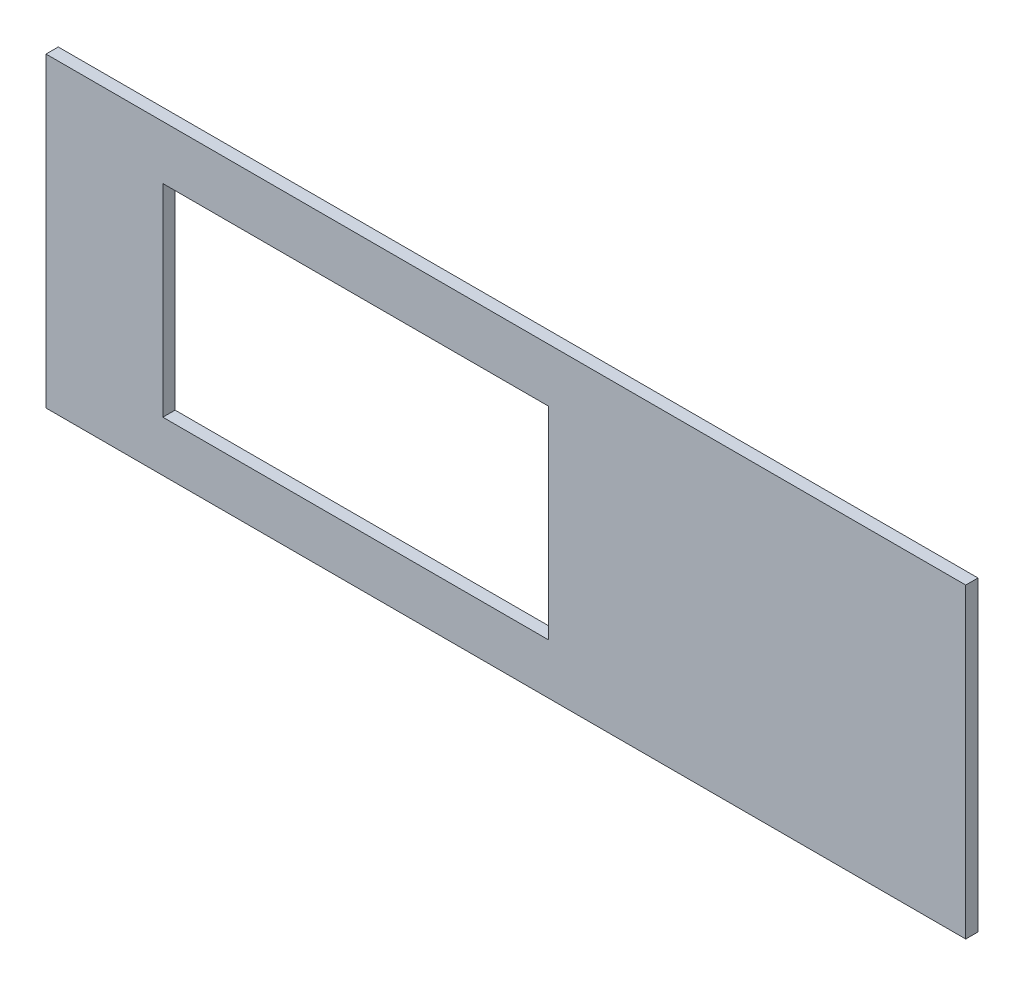
ISO-10303-21;
HEADER;
FILE_DESCRIPTION(('STEP AP214'),'2;1');
FILE_NAME('part.step','',(''),(''),'','','');
FILE_SCHEMA(('AUTOMOTIVE_DESIGN { 1 0 10303 214 1 1 1 1 }'));
ENDSEC;
DATA;
#1=APPLICATION_CONTEXT('core data for automotive mechanical design processes');
#2=APPLICATION_PROTOCOL_DEFINITION('international standard','automotive_design',2000,#1);
#3=PRODUCT_CONTEXT('',#1,'mechanical');
#4=PRODUCT('Part','Part','',(#3));
#5=PRODUCT_RELATED_PRODUCT_CATEGORY('part','',(#4));
#6=PRODUCT_DEFINITION_FORMATION('','',#4);
#7=PRODUCT_DEFINITION_CONTEXT('part definition',#1,'design');
#8=PRODUCT_DEFINITION('design','',#6,#7);
#9=PRODUCT_DEFINITION_SHAPE('','',#8);
#10=(LENGTH_UNIT() NAMED_UNIT(*) SI_UNIT(.MILLI.,.METRE.));
#11=(NAMED_UNIT(*) PLANE_ANGLE_UNIT() SI_UNIT($,.RADIAN.));
#12=(NAMED_UNIT(*) SI_UNIT($,.STERADIAN.) SOLID_ANGLE_UNIT());
#13=UNCERTAINTY_MEASURE_WITH_UNIT(LENGTH_MEASURE(1.E-05),#10,'distance_accuracy_value','');
#14=(GEOMETRIC_REPRESENTATION_CONTEXT(3) GLOBAL_UNCERTAINTY_ASSIGNED_CONTEXT((#13)) GLOBAL_UNIT_ASSIGNED_CONTEXT((#10,
#11,#12)) REPRESENTATION_CONTEXT('',''));
#15=CARTESIAN_POINT('',(0.,0.,0.));
#16=DIRECTION('',(0.,0.,1.));
#17=DIRECTION('',(1.,0.,0.));
#18=AXIS2_PLACEMENT_3D('',#15,#16,#17);
#19=CARTESIAN_POINT('',(-352.653061224484,0.,-12.));
#20=DIRECTION('',(-1.,0.,0.));
#21=DIRECTION('',(0.,-1.,0.));
#22=AXIS2_PLACEMENT_3D('',#19,#20,#21);
#23=PLANE('',#22);
#24=DIRECTION('',(0.,-1.,0.));
#25=VECTOR('',#24,1.);
#26=CARTESIAN_POINT('',(-352.653061224484,0.,0.));
#27=LINE('',#26,#25);
#28=CARTESIAN_POINT('',(-352.653061224483,300.,0.));
#29=VERTEX_POINT('',#28);
#30=CARTESIAN_POINT('',(-352.653061224484,0.,0.));
#31=VERTEX_POINT('',#30);
#32=EDGE_CURVE('E131',#29,#31,#27,.T.);
#33=ORIENTED_EDGE('',*,*,#32,.F.);
#34=DIRECTION('',(0.,0.,1.));
#35=VECTOR('',#34,1.);
#36=CARTESIAN_POINT('',(-352.653061224483,300.,-12.));
#37=LINE('',#36,#35);
#38=CARTESIAN_POINT('',(-352.653061224483,300.,-12.));
#39=VERTEX_POINT('',#38);
#40=EDGE_CURVE('E11',#39,#29,#37,.T.);
#41=ORIENTED_EDGE('',*,*,#40,.F.);
#42=DIRECTION('',(0.,-1.,0.));
#43=VECTOR('',#42,1.);
#44=CARTESIAN_POINT('',(-352.653061224484,0.,-12.));
#45=LINE('',#44,#43);
#46=CARTESIAN_POINT('',(-352.653061224484,0.,-12.));
#47=VERTEX_POINT('',#46);
#48=EDGE_CURVE('E135',#39,#47,#45,.T.);
#49=ORIENTED_EDGE('',*,*,#48,.T.);
#50=DIRECTION('',(0.,0.,1.));
#51=VECTOR('',#50,1.);
#52=CARTESIAN_POINT('',(-352.653061224484,0.,-12.));
#53=LINE('',#52,#51);
#54=EDGE_CURVE('E36',#47,#31,#53,.T.);
#55=ORIENTED_EDGE('',*,*,#54,.T.);
#56=EDGE_LOOP('',(#33,#41,#49,#55));
#57=FACE_BOUND('',#56,.T.);
#58=ADVANCED_FACE('F33',(#57),#23,.T.);
#59=CARTESIAN_POINT('',(-352.653061224483,300.,-12.));
#60=DIRECTION('',(0.,1.,0.));
#61=DIRECTION('',(0.,0.,1.));
#62=AXIS2_PLACEMENT_3D('',#59,#60,#61);
#63=PLANE('',#62);
#64=DIRECTION('',(-1.,0.,0.));
#65=VECTOR('',#64,1.);
#66=CARTESIAN_POINT('',(-352.653061224483,300.,0.));
#67=LINE('',#66,#65);
#68=CARTESIAN_POINT('',(547.34693877551,300.,0.));
#69=VERTEX_POINT('',#68);
#70=EDGE_CURVE('E139',#69,#29,#67,.T.);
#71=ORIENTED_EDGE('',*,*,#70,.F.);
#72=DIRECTION('',(0.,0.,1.));
#73=VECTOR('',#72,1.);
#74=CARTESIAN_POINT('',(547.34693877551,300.,-12.));
#75=LINE('',#74,#73);
#76=CARTESIAN_POINT('',(547.34693877551,300.,-12.));
#77=VERTEX_POINT('',#76);
#78=EDGE_CURVE('E41',#77,#69,#75,.T.);
#79=ORIENTED_EDGE('',*,*,#78,.F.);
#80=DIRECTION('',(-1.,0.,0.));
#81=VECTOR('',#80,1.);
#82=CARTESIAN_POINT('',(-352.653061224483,300.,-12.));
#83=LINE('',#82,#81);
#84=EDGE_CURVE('E145',#77,#39,#83,.T.);
#85=ORIENTED_EDGE('',*,*,#84,.T.);
#86=ORIENTED_EDGE('',*,*,#40,.T.);
#87=EDGE_LOOP('',(#71,#79,#85,#86));
#88=FACE_BOUND('',#87,.T.);
#89=ADVANCED_FACE('F171',(#88),#63,.T.);
#90=CARTESIAN_POINT('',(547.34693877551,0.,-12.));
#91=DIRECTION('',(1.,0.,0.));
#92=DIRECTION('',(0.,0.,-1.));
#93=AXIS2_PLACEMENT_3D('',#90,#91,#92);
#94=PLANE('',#93);
#95=DIRECTION('',(0.,1.,0.));
#96=VECTOR('',#95,1.);
#97=CARTESIAN_POINT('',(547.34693877551,0.,0.));
#98=LINE('',#97,#96);
#99=CARTESIAN_POINT('',(547.34693877551,0.,0.));
#100=VERTEX_POINT('',#99);
#101=EDGE_CURVE('E153',#100,#69,#98,.T.);
#102=ORIENTED_EDGE('',*,*,#101,.F.);
#103=DIRECTION('',(0.,0.,1.));
#104=VECTOR('',#103,1.);
#105=CARTESIAN_POINT('',(547.34693877551,0.,-12.));
#106=LINE('',#105,#104);
#107=CARTESIAN_POINT('',(547.34693877551,0.,-12.));
#108=VERTEX_POINT('',#107);
#109=EDGE_CURVE('E158',#108,#100,#106,.T.);
#110=ORIENTED_EDGE('',*,*,#109,.F.);
#111=DIRECTION('',(0.,1.,0.));
#112=VECTOR('',#111,1.);
#113=CARTESIAN_POINT('',(547.34693877551,0.,-12.));
#114=LINE('',#113,#112);
#115=EDGE_CURVE('E142',#108,#77,#114,.T.);
#116=ORIENTED_EDGE('',*,*,#115,.T.);
#117=ORIENTED_EDGE('',*,*,#78,.T.);
#118=EDGE_LOOP('',(#102,#110,#116,#117));
#119=FACE_BOUND('',#118,.T.);
#120=ADVANCED_FACE('F175',(#119),#94,.T.);
#121=CARTESIAN_POINT('',(-352.653061224484,0.,-12.));
#122=DIRECTION('',(0.,-1.,0.));
#123=DIRECTION('',(0.,0.,-1.));
#124=AXIS2_PLACEMENT_3D('',#121,#122,#123);
#125=PLANE('',#124);
#126=DIRECTION('',(1.,0.,0.));
#127=VECTOR('',#126,1.);
#128=CARTESIAN_POINT('',(-352.653061224484,0.,0.));
#129=LINE('',#128,#127);
#130=EDGE_CURVE('E150',#31,#100,#129,.T.);
#131=ORIENTED_EDGE('',*,*,#130,.F.);
#132=ORIENTED_EDGE('',*,*,#54,.F.);
#133=DIRECTION('',(1.,0.,0.));
#134=VECTOR('',#133,1.);
#135=CARTESIAN_POINT('',(-352.653061224484,0.,-12.));
#136=LINE('',#135,#134);
#137=EDGE_CURVE('E138',#47,#108,#136,.T.);
#138=ORIENTED_EDGE('',*,*,#137,.T.);
#139=ORIENTED_EDGE('',*,*,#109,.T.);
#140=EDGE_LOOP('',(#131,#132,#138,#139));
#141=FACE_BOUND('',#140,.T.);
#142=ADVANCED_FACE('F166',(#141),#125,.T.);
#143=CARTESIAN_POINT('',(0.,0.,-12.));
#144=DIRECTION('',(0.,0.,-1.));
#145=DIRECTION('',(-1.,0.,0.));
#146=AXIS2_PLACEMENT_3D('',#143,#144,#145);
#147=PLANE('',#146);
#148=DIRECTION('',(0.,1.,0.));
#149=VECTOR('',#148,1.);
#150=CARTESIAN_POINT('',(139.150083362304,49.4032246659231,-12.));
#151=LINE('',#150,#149);
#152=CARTESIAN_POINT('',(139.150083362304,49.4032246659231,-12.));
#153=VERTEX_POINT('',#152);
#154=CARTESIAN_POINT('',(139.150083362304,247.444008379091,-12.));
#155=VERTEX_POINT('',#154);
#156=EDGE_CURVE('E100',#153,#155,#151,.T.);
#157=ORIENTED_EDGE('',*,*,#156,.T.);
#158=DIRECTION('',(-1.,0.,0.));
#159=VECTOR('',#158,1.);
#160=CARTESIAN_POINT('',(139.150083362304,247.444008379091,-12.));
#161=LINE('',#160,#159);
#162=CARTESIAN_POINT('',(-238.316927651788,247.444008379091,-12.));
#163=VERTEX_POINT('',#162);
#164=EDGE_CURVE('E109',#155,#163,#161,.T.);
#165=ORIENTED_EDGE('',*,*,#164,.T.);
#166=DIRECTION('',(0.,-1.,0.));
#167=VECTOR('',#166,1.);
#168=CARTESIAN_POINT('',(-238.316927651788,49.4032246659231,-12.));
#169=LINE('',#168,#167);
#170=CARTESIAN_POINT('',(-238.316927651788,49.4032246659231,-12.));
#171=VERTEX_POINT('',#170);
#172=EDGE_CURVE('E49',#163,#171,#169,.T.);
#173=ORIENTED_EDGE('',*,*,#172,.T.);
#174=DIRECTION('',(1.,0.,0.));
#175=VECTOR('',#174,1.);
#176=CARTESIAN_POINT('',(139.150083362304,49.4032246659231,-12.));
#177=LINE('',#176,#175);
#178=EDGE_CURVE('E106',#171,#153,#177,.T.);
#179=ORIENTED_EDGE('',*,*,#178,.T.);
#180=EDGE_LOOP('',(#157,#165,#173,#179));
#181=FACE_BOUND('',#180,.T.);
#182=ORIENTED_EDGE('',*,*,#48,.F.);
#183=ORIENTED_EDGE('',*,*,#84,.F.);
#184=ORIENTED_EDGE('',*,*,#115,.F.);
#185=ORIENTED_EDGE('',*,*,#137,.F.);
#186=EDGE_LOOP('',(#182,#183,#184,#185));
#187=FACE_BOUND('',#186,.T.);
#188=ADVANCED_FACE('F113',(#181,#187),#147,.T.);
#189=CARTESIAN_POINT('',(0.,0.,0.));
#190=DIRECTION('',(0.,0.,-1.));
#191=DIRECTION('',(-1.,0.,0.));
#192=AXIS2_PLACEMENT_3D('',#189,#190,#191);
#193=PLANE('',#192);
#194=DIRECTION('',(-1.,0.,0.));
#195=VECTOR('',#194,1.);
#196=CARTESIAN_POINT('',(139.150083362304,247.444008379091,0.));
#197=LINE('',#196,#195);
#198=CARTESIAN_POINT('',(139.150083362304,247.444008379091,0.));
#199=VERTEX_POINT('',#198);
#200=CARTESIAN_POINT('',(-238.316927651788,247.444008379091,0.));
#201=VERTEX_POINT('',#200);
#202=EDGE_CURVE('E125',#199,#201,#197,.T.);
#203=ORIENTED_EDGE('',*,*,#202,.F.);
#204=DIRECTION('',(0.,1.,0.));
#205=VECTOR('',#204,1.);
#206=CARTESIAN_POINT('',(139.150083362304,49.4032246659231,0.));
#207=LINE('',#206,#205);
#208=CARTESIAN_POINT('',(139.150083362304,49.4032246659231,0.));
#209=VERTEX_POINT('',#208);
#210=EDGE_CURVE('E57',#209,#199,#207,.T.);
#211=ORIENTED_EDGE('',*,*,#210,.F.);
#212=DIRECTION('',(1.,0.,0.));
#213=VECTOR('',#212,1.);
#214=CARTESIAN_POINT('',(139.150083362304,49.4032246659231,0.));
#215=LINE('',#214,#213);
#216=CARTESIAN_POINT('',(-238.316927651788,49.4032246659231,0.));
#217=VERTEX_POINT('',#216);
#218=EDGE_CURVE('E116',#217,#209,#215,.T.);
#219=ORIENTED_EDGE('',*,*,#218,.F.);
#220=DIRECTION('',(0.,-1.,0.));
#221=VECTOR('',#220,1.);
#222=CARTESIAN_POINT('',(-238.316927651788,49.4032246659231,0.));
#223=LINE('',#222,#221);
#224=EDGE_CURVE('E119',#201,#217,#223,.T.);
#225=ORIENTED_EDGE('',*,*,#224,.F.);
#226=EDGE_LOOP('',(#203,#211,#219,#225));
#227=FACE_BOUND('',#226,.T.);
#228=ORIENTED_EDGE('',*,*,#32,.T.);
#229=ORIENTED_EDGE('',*,*,#130,.T.);
#230=ORIENTED_EDGE('',*,*,#101,.T.);
#231=ORIENTED_EDGE('',*,*,#70,.T.);
#232=EDGE_LOOP('',(#228,#229,#230,#231));
#233=FACE_BOUND('',#232,.T.);
#234=ADVANCED_FACE('F168',(#227,#233),#193,.F.);
#235=CARTESIAN_POINT('',(139.150083362304,49.4032246659231,-12.));
#236=DIRECTION('',(1.,0.,0.));
#237=DIRECTION('',(0.,0.,-1.));
#238=AXIS2_PLACEMENT_3D('',#235,#236,#237);
#239=PLANE('',#238);
#240=ORIENTED_EDGE('',*,*,#210,.T.);
#241=DIRECTION('',(0.,0.,1.));
#242=VECTOR('',#241,1.);
#243=CARTESIAN_POINT('',(139.150083362304,247.444008379091,-12.));
#244=LINE('',#243,#242);
#245=EDGE_CURVE('E96',#155,#199,#244,.T.);
#246=ORIENTED_EDGE('',*,*,#245,.F.);
#247=ORIENTED_EDGE('',*,*,#156,.F.);
#248=DIRECTION('',(0.,0.,1.));
#249=VECTOR('',#248,1.);
#250=CARTESIAN_POINT('',(139.150083362304,49.4032246659231,-12.));
#251=LINE('',#250,#249);
#252=EDGE_CURVE('E129',#153,#209,#251,.T.);
#253=ORIENTED_EDGE('',*,*,#252,.T.);
#254=EDGE_LOOP('',(#240,#246,#247,#253));
#255=FACE_BOUND('',#254,.T.);
#256=ADVANCED_FACE('F98',(#255),#239,.F.);
#257=CARTESIAN_POINT('',(139.150083362304,49.4032246659231,-12.));
#258=DIRECTION('',(0.,-1.,0.));
#259=DIRECTION('',(0.,0.,-1.));
#260=AXIS2_PLACEMENT_3D('',#257,#258,#259);
#261=PLANE('',#260);
#262=ORIENTED_EDGE('',*,*,#218,.T.);
#263=ORIENTED_EDGE('',*,*,#252,.F.);
#264=ORIENTED_EDGE('',*,*,#178,.F.);
#265=DIRECTION('',(0.,0.,1.));
#266=VECTOR('',#265,1.);
#267=CARTESIAN_POINT('',(-238.316927651788,49.4032246659231,-12.));
#268=LINE('',#267,#266);
#269=EDGE_CURVE('E132',#171,#217,#268,.T.);
#270=ORIENTED_EDGE('',*,*,#269,.T.);
#271=EDGE_LOOP('',(#262,#263,#264,#270));
#272=FACE_BOUND('',#271,.T.);
#273=ADVANCED_FACE('F226',(#272),#261,.F.);
#274=CARTESIAN_POINT('',(-238.316927651788,49.4032246659231,-12.));
#275=DIRECTION('',(-1.,0.,0.));
#276=DIRECTION('',(0.,0.,1.));
#277=AXIS2_PLACEMENT_3D('',#274,#275,#276);
#278=PLANE('',#277);
#279=ORIENTED_EDGE('',*,*,#224,.T.);
#280=ORIENTED_EDGE('',*,*,#269,.F.);
#281=ORIENTED_EDGE('',*,*,#172,.F.);
#282=DIRECTION('',(0.,0.,1.));
#283=VECTOR('',#282,1.);
#284=CARTESIAN_POINT('',(-238.316927651788,247.444008379091,-12.));
#285=LINE('',#284,#283);
#286=EDGE_CURVE('E105',#163,#201,#285,.T.);
#287=ORIENTED_EDGE('',*,*,#286,.T.);
#288=EDGE_LOOP('',(#279,#280,#281,#287));
#289=FACE_BOUND('',#288,.T.);
#290=ADVANCED_FACE('F235',(#289),#278,.F.);
#291=CARTESIAN_POINT('',(139.150083362304,247.444008379091,-12.));
#292=DIRECTION('',(0.,1.,0.));
#293=DIRECTION('',(0.,0.,1.));
#294=AXIS2_PLACEMENT_3D('',#291,#292,#293);
#295=PLANE('',#294);
#296=ORIENTED_EDGE('',*,*,#202,.T.);
#297=ORIENTED_EDGE('',*,*,#286,.F.);
#298=ORIENTED_EDGE('',*,*,#164,.F.);
#299=ORIENTED_EDGE('',*,*,#245,.T.);
#300=EDGE_LOOP('',(#296,#297,#298,#299));
#301=FACE_BOUND('',#300,.T.);
#302=ADVANCED_FACE('F110',(#301),#295,.F.);
#303=CLOSED_SHELL('',(#58,#89,#120,#142,#188,#234,#256,#273,#290,#302));
#304=MANIFOLD_SOLID_BREP('B2',#303);
#305=ADVANCED_BREP_SHAPE_REPRESENTATION('',(#18,#304),#14);
#306=SHAPE_DEFINITION_REPRESENTATION(#9,#305);
ENDSEC;
END-ISO-10303-21;
